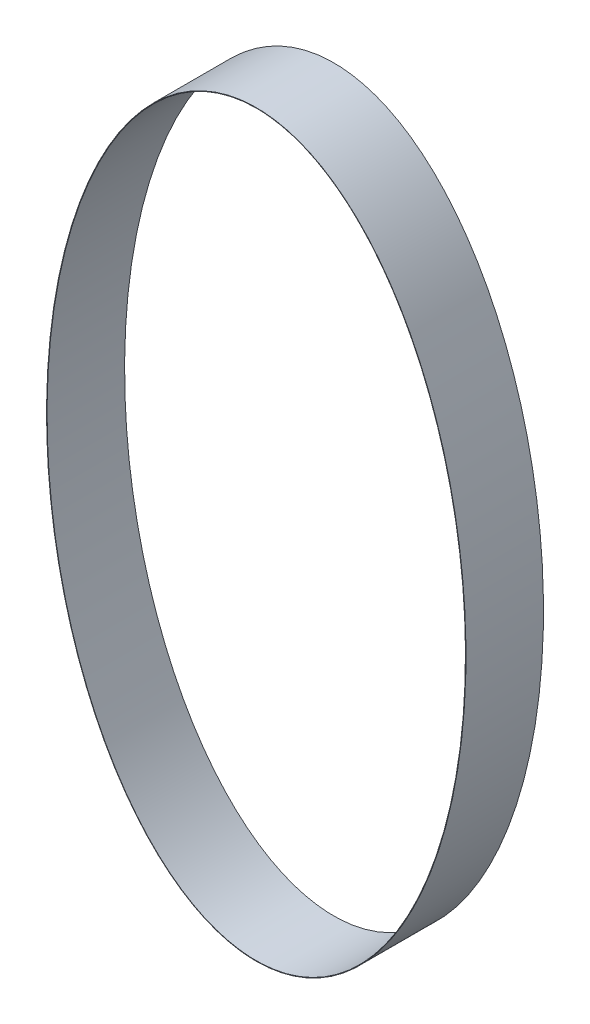
ISO-10303-21;
HEADER;
FILE_DESCRIPTION(('STEP AP214'),'2;1');
FILE_NAME('part.step','',(''),(''),'','','');
FILE_SCHEMA(('AUTOMOTIVE_DESIGN { 1 0 10303 214 1 1 1 1 }'));
ENDSEC;
DATA;
#1=APPLICATION_CONTEXT('core data for automotive mechanical design processes');
#2=APPLICATION_PROTOCOL_DEFINITION('international standard','automotive_design',2000,#1);
#3=PRODUCT_CONTEXT('',#1,'mechanical');
#4=PRODUCT('Part','Part','',(#3));
#5=PRODUCT_RELATED_PRODUCT_CATEGORY('part','',(#4));
#6=PRODUCT_DEFINITION_FORMATION('','',#4);
#7=PRODUCT_DEFINITION_CONTEXT('part definition',#1,'design');
#8=PRODUCT_DEFINITION('design','',#6,#7);
#9=PRODUCT_DEFINITION_SHAPE('','',#8);
#10=(LENGTH_UNIT() NAMED_UNIT(*) SI_UNIT(.MILLI.,.METRE.));
#11=(NAMED_UNIT(*) PLANE_ANGLE_UNIT() SI_UNIT($,.RADIAN.));
#12=(NAMED_UNIT(*) SI_UNIT($,.STERADIAN.) SOLID_ANGLE_UNIT());
#13=UNCERTAINTY_MEASURE_WITH_UNIT(LENGTH_MEASURE(1.E-05),#10,'distance_accuracy_value','');
#14=(GEOMETRIC_REPRESENTATION_CONTEXT(3) GLOBAL_UNCERTAINTY_ASSIGNED_CONTEXT((#13)) GLOBAL_UNIT_ASSIGNED_CONTEXT((#10,
#11,#12)) REPRESENTATION_CONTEXT('',''));
#15=CARTESIAN_POINT('',(0.,0.,0.));
#16=DIRECTION('',(0.,0.,1.));
#17=DIRECTION('',(1.,0.,0.));
#18=AXIS2_PLACEMENT_3D('',#15,#16,#17);
#19=CARTESIAN_POINT('',(0.95522640346659,381.504286316459,40.005));
#20=DIRECTION('',(0.,0.,-1.));
#21=DIRECTION('',(-1.,0.,0.));
#22=AXIS2_PLACEMENT_3D('',#19,#20,#21);
#23=PLANE('',#22);
#24=CARTESIAN_POINT('',(0.,-381.508,40.005));
#25=CARTESIAN_POINT('',(5.06860746852134,-381.508,40.005));
#26=CARTESIAN_POINT('',(10.080651700134,-381.194846210065,40.005));
#27=CARTESIAN_POINT('',(19.9980403594174,-379.977811334237,40.005));
#28=CARTESIAN_POINT('',(24.9033700403315,-379.07384860516,40.005));
#29=CARTESIAN_POINT('',(32.1846436224367,-377.293150657071,40.005));
#30=CARTESIAN_POINT('',(34.5989338511966,-376.628714069901,40.005));
#31=CARTESIAN_POINT('',(39.4023093953058,-375.160297711844,40.005));
#32=CARTESIAN_POINT('',(41.7927877797297,-374.355803421202,40.005));
#33=CARTESIAN_POINT('',(48.9182745677866,-371.738678905635,40.005));
#34=CARTESIAN_POINT('',(53.5360386053732,-369.749691859683,40.005));
#35=CARTESIAN_POINT('',(62.5351349099683,-365.336101736664,40.005));
#36=CARTESIAN_POINT('',(66.9163797770954,-362.911337628827,40.005));
#37=CARTESIAN_POINT('',(73.3268117040244,-358.976753281723,40.005));
#38=CARTESIAN_POINT('',(75.4366675456447,-357.615562029518,40.005));
#39=CARTESIAN_POINT('',(78.5626370804195,-355.502261497353,40.005));
#40=CARTESIAN_POINT('',(79.5981555108845,-354.785904665684,40.005));
#41=CARTESIAN_POINT('',(81.656492469039,-353.329791942105,40.005));
#42=CARTESIAN_POINT('',(82.6803079712479,-352.589292895675,40.005));
#43=CARTESIAN_POINT('',(87.7552455809092,-348.838981831497,40.005));
#44=CARTESIAN_POINT('',(91.6651392721151,-345.693654823046,40.005));
#45=CARTESIAN_POINT('',(99.2224594922293,-339.149241199157,40.005));
#46=CARTESIAN_POINT('',(102.86976577271,-335.750038324627,40.005));
#47=CARTESIAN_POINT('',(113.45992960344,-325.212344440494,40.005));
#48=CARTESIAN_POINT('',(120.053162703315,-317.735828047664,40.005));
#49=CARTESIAN_POINT('',(127.807005400265,-307.918663667377,40.005));
#50=CARTESIAN_POINT('',(129.333210684158,-305.931482441215,40.005));
#51=CARTESIAN_POINT('',(132.338256217193,-301.91132632656,40.005));
#52=CARTESIAN_POINT('',(133.818941004382,-299.875713391325,40.005));
#53=CARTESIAN_POINT('',(138.177317193406,-293.72379226869,40.005));
#54=CARTESIAN_POINT('',(140.969004262098,-289.56675330864,40.005));
#55=CARTESIAN_POINT('',(149.03615513247,-276.944899174484,40.005));
#56=CARTESIAN_POINT('',(154.00532397218,-268.330137551269,40.005));
#57=CARTESIAN_POINT('',(163.253070132247,-250.762535789129,40.005));
#58=CARTESIAN_POINT('',(167.530893184904,-241.809326399066,40.005));
#59=CARTESIAN_POINT('',(175.47735123777,-223.604680104137,40.005));
#60=CARTESIAN_POINT('',(179.145598480575,-214.35305337295,40.005));
#61=CARTESIAN_POINT('',(184.231845420286,-200.271900147928,40.005));
#62=CARTESIAN_POINT('',(185.85772710484,-195.544142111794,40.005));
#63=CARTESIAN_POINT('',(188.975447972995,-186.023005642383,40.005));
#64=CARTESIAN_POINT('',(190.461472941253,-181.247227793017,40.005));
#65=CARTESIAN_POINT('',(194.707136831891,-166.895340314192,40.005));
#66=CARTESIAN_POINT('',(197.257659953542,-157.286432193541,40.005));
#67=CARTESIAN_POINT('',(201.848792991668,-137.993959332423,40.005));
#68=CARTESIAN_POINT('',(203.889226786354,-128.310368805888,40.005));
#69=CARTESIAN_POINT('',(207.493672125557,-108.873434558664,40.005));
#70=CARTESIAN_POINT('',(209.057582152273,-99.1200759747086,40.005));
#71=CARTESIAN_POINT('',(211.730623999268,-79.546774526742,40.005));
#72=CARTESIAN_POINT('',(212.839699737427,-69.7268234517226,40.005));
#73=CARTESIAN_POINT('',(214.615137764104,-50.0221034280512,40.005));
#74=CARTESIAN_POINT('',(215.281475397204,-40.1373308695885,40.005));
#75=CARTESIAN_POINT('',(216.175088211129,-20.303502423184,40.005));
#76=CARTESIAN_POINT('',(216.402364510989,-10.3544466990802,40.005));
#77=CARTESIAN_POINT('',(216.410662727345,4.6178353781742,40.005));
#78=CARTESIAN_POINT('',(216.357735293357,9.61978662181301,40.005));
#79=CARTESIAN_POINT('',(216.14106098061,19.5936145387797,40.005));
#80=CARTESIAN_POINT('',(215.977391607286,24.570895204033,40.005));
#81=CARTESIAN_POINT('',(215.321175424922,39.4739746127025,40.005));
#82=CARTESIAN_POINT('',(214.663674170421,49.3710549235263,40.005));
#83=CARTESIAN_POINT('',(212.906717804489,69.08827174403,40.005));
#84=CARTESIAN_POINT('',(211.807281522385,78.9084115318805,40.005));
#85=CARTESIAN_POINT('',(209.156215027436,98.4699645180522,40.005));
#86=CARTESIAN_POINT('',(207.604633474188,108.211386187969,40.005));
#87=CARTESIAN_POINT('',(204.029726660789,127.612099338406,40.005));
#88=CARTESIAN_POINT('',(202.006491799108,137.271406557224,40.005));
#89=CARTESIAN_POINT('',(197.457389585685,156.502513093851,40.005));
#90=CARTESIAN_POINT('',(194.931679535016,166.074339797645,40.005));
#91=CARTESIAN_POINT('',(189.3318013842,185.122507112211,40.005));
#92=CARTESIAN_POINT('',(186.257909896902,194.598895881052,40.005));
#93=CARTESIAN_POINT('',(182.030869451122,206.377410053413,40.005));
#94=CARTESIAN_POINT('',(181.165481957024,208.731536725947,40.005));
#95=CARTESIAN_POINT('',(179.398565415938,213.422841513929,40.005));
#96=CARTESIAN_POINT('',(178.497235772423,215.759594251006,40.005));
#97=CARTESIAN_POINT('',(175.738424981424,222.742552055598,40.005));
#98=CARTESIAN_POINT('',(173.826170811565,227.361481037049,40.005));
#99=CARTESIAN_POINT('',(167.858985487828,241.103521118126,40.005));
#100=CARTESIAN_POINT('',(163.574724181348,250.112429482395,40.005));
#101=CARTESIAN_POINT('',(154.311801335294,267.784446039641,40.005));
#102=CARTESIAN_POINT('',(149.333883901231,276.447924785221,40.005));
#103=CARTESIAN_POINT('',(142.599569251185,287.022346340211,40.005));
#104=CARTESIAN_POINT('',(141.22536009406,289.126783600521,40.005));
#105=CARTESIAN_POINT('',(138.431507227753,293.295906136321,40.005));
#106=CARTESIAN_POINT('',(137.012576637843,295.359668435152,40.005));
#107=CARTESIAN_POINT('',(132.687668036583,301.486569320955,40.005));
#108=CARTESIAN_POINT('',(129.713671845214,305.485415145518,40.005));
#109=CARTESIAN_POINT('',(120.499484395732,317.205757742107,40.005));
#110=CARTESIAN_POINT('',(113.969547741985,324.653378737455,40.005));
#111=CARTESIAN_POINT('',(103.478699270663,335.166984197997,40.005));
#112=CARTESIAN_POINT('',(99.8652283955802,338.561379949128,40.005));
#113=CARTESIAN_POINT('',(92.377040014029,345.103233535711,40.005));
#114=CARTESIAN_POINT('',(88.5024425652875,348.250804853221,40.005));
#115=CARTESIAN_POINT('',(82.4665741346365,352.760456736282,40.005));
#116=CARTESIAN_POINT('',(80.4158064663773,354.22926583905,40.005));
#117=CARTESIAN_POINT('',(76.2393092805904,357.086579404227,40.005));
#118=CARTESIAN_POINT('',(74.1270091831982,358.465945990474,40.005));
#119=CARTESIAN_POINT('',(67.7154037694135,362.450948045406,40.005));
#120=CARTESIAN_POINT('',(63.3415467378939,364.903800195423,40.005));
#121=CARTESIAN_POINT('',(54.3780676424367,369.367324223019,40.005));
#122=CARTESIAN_POINT('',(49.7885071841226,371.378122352713,40.005));
#123=CARTESIAN_POINT('',(42.7255437689254,374.02825723621,40.005));
#124=CARTESIAN_POINT('',(40.34140268195,374.850523714593,40.005));
#125=CARTESIAN_POINT('',(36.7178173237749,375.98683759953,40.005));
#126=CARTESIAN_POINT('',(35.5008911746417,376.349689767248,40.005));
#127=CARTESIAN_POINT('',(33.0667845156843,377.037700847886,40.005));
#128=CARTESIAN_POINT('',(31.8478228779317,377.363455466801,40.005));
#129=CARTESIAN_POINT('',(25.7434579760028,378.900828852417,40.005));
#130=CARTESIAN_POINT('',(20.8294193367162,379.838580976288,40.005));
#131=CARTESIAN_POINT('',(10.9393108357944,381.120823129518,40.005));
#132=CARTESIAN_POINT('',(5.96324443516485,381.465346259683,40.005));
#133=CARTESIAN_POINT('',(-1.54878261238325,381.523756344847,40.005));
#134=CARTESIAN_POINT('',(-4.06078717998354,381.466757498387,40.005));
#135=CARTESIAN_POINT('',(-7.84103774992907,381.264161195904,40.005));
#136=CARTESIAN_POINT('',(-9.10316243843965,381.177107539749,40.005));
#137=CARTESIAN_POINT('',(-11.6315427282551,380.963492478216,40.005));
#138=CARTESIAN_POINT('',(-12.8938169031269,380.837222532151,40.005));
#139=CARTESIAN_POINT('',(-19.174011721568,380.112318814165,40.005));
#140=CARTESIAN_POINT('',(-24.120516267387,379.231735943224,40.005));
#141=CARTESIAN_POINT('',(-33.8687425606447,376.909982340287,40.005));
#142=CARTESIAN_POINT('',(-38.6704387434527,375.468712624005,40.005));
#143=CARTESIAN_POINT('',(-45.7700221947838,372.908151661415,40.005));
#144=CARTESIAN_POINT('',(-48.1193691493979,371.988108362231,40.005));
#145=CARTESIAN_POINT('',(-51.6181563375289,370.510342234018,40.005));
#146=CARTESIAN_POINT('',(-52.7803389011319,370.001343064054,40.005));
#147=CARTESIAN_POINT('',(-55.0832632060132,368.957270013458,40.005));
#148=CARTESIAN_POINT('',(-56.2257027421524,368.421498038351,40.005));
#149=CARTESIAN_POINT('',(-61.894272699129,365.676222126775,40.005));
#150=CARTESIAN_POINT('',(-66.2898991175842,363.268047304305,40.005));
#151=CARTESIAN_POINT('',(-74.8341052082076,358.07560960787,40.005));
#152=CARTESIAN_POINT('',(-78.9825888698252,355.291200573628,40.005));
#153=CARTESIAN_POINT('',(-87.0558125907057,349.381769658751,40.005));
#154=CARTESIAN_POINT('',(-90.9804926050011,346.256656369526,40.005));
#155=CARTESIAN_POINT('',(-95.7576026809499,342.154279364,40.005));
#156=CARTESIAN_POINT('',(-96.7065762827026,341.323987313693,40.005));
#157=CARTESIAN_POINT('',(-98.5918629977503,339.644129701054,40.005));
#158=CARTESIAN_POINT('',(-99.5279679018261,338.794713652075,40.005));
#159=CARTESIAN_POINT('',(-102.307102316207,336.228034050927,40.005));
#160=CARTESIAN_POINT('',(-104.12463591167,334.489122580848,40.005));
#161=CARTESIAN_POINT('',(-109.478299747474,329.194323992999,40.005));
#162=CARTESIAN_POINT('',(-112.915729486879,325.560559263375,40.005));
#163=CARTESIAN_POINT('',(-119.556303113019,318.108171343186,40.005));
#164=CARTESIAN_POINT('',(-122.759370107401,314.289487482282,40.005));
#165=CARTESIAN_POINT('',(-132.050430789835,302.582413801215,40.005));
#166=CARTESIAN_POINT('',(-137.821929761857,294.444300297633,40.005));
#167=CARTESIAN_POINT('',(-145.939145808168,281.811028511373,40.005));
#168=CARTESIAN_POINT('',(-148.554411539712,277.528552084471,40.005));
#169=CARTESIAN_POINT('',(-153.615082382469,268.829574181818,40.005));
#170=CARTESIAN_POINT('',(-156.045555838112,264.438694028759,40.005));
#171=CARTESIAN_POINT('',(-163.055528911275,251.166813526239,40.005));
#172=CARTESIAN_POINT('',(-167.358633469695,242.180515642892,40.005));
#173=CARTESIAN_POINT('',(-175.327799004157,223.96980547362,40.005));
#174=CARTESIAN_POINT('',(-178.99332030713,214.745191468481,40.005));
#175=CARTESIAN_POINT('',(-185.754998497077,196.083146201243,40.005));
#176=CARTESIAN_POINT('',(-188.85086674615,186.645607051956,40.005));
#177=CARTESIAN_POINT('',(-194.51887472505,167.574769299987,40.005));
#178=CARTESIAN_POINT('',(-197.090852836514,157.94141028753,40.005));
#179=CARTESIAN_POINT('',(-199.99721194363,145.784357833635,40.005));
#180=CARTESIAN_POINT('',(-200.56302019141,143.347167362173,40.005));
#181=CARTESIAN_POINT('',(-201.664057263176,138.461356430111,40.005));
#182=CARTESIAN_POINT('',(-202.199475944263,136.011748109736,40.005));
#183=CARTESIAN_POINT('',(-203.756394452269,128.66500589533,40.005));
#184=CARTESIAN_POINT('',(-204.729929825771,123.764242606959,40.005));
#185=CARTESIAN_POINT('',(-207.464784225714,109.053488127847,40.005));
#186=CARTESIAN_POINT('',(-209.040722344995,99.2350492208898,40.005));
#187=CARTESIAN_POINT('',(-211.727648321507,79.5769838535848,40.005));
#188=CARTESIAN_POINT('',(-212.838551920334,69.7373535536224,40.005));
#189=CARTESIAN_POINT('',(-214.613926808992,50.0377492542653,40.005));
#190=CARTESIAN_POINT('',(-215.278352905904,40.1777731954511,40.005));
#191=CARTESIAN_POINT('',(-216.170321262913,20.4379124975421,40.005));
#192=CARTESIAN_POINT('',(-216.397846570205,10.5580270859171,40.005));
#193=CARTESIAN_POINT('',(-216.417489816181,-9.22158503568852,40.005));
#194=CARTESIAN_POINT('',(-216.209615254981,-19.1213114038917,40.005));
#195=CARTESIAN_POINT('',(-215.351995533629,-38.9408999648625,40.005));
#196=CARTESIAN_POINT('',(-214.702283983819,-48.8607606260227,40.005));
#197=CARTESIAN_POINT('',(-213.385057850676,-63.7561664101207,40.005));
#198=CARTESIAN_POINT('',(-212.888802766121,-68.723907322436,40.005));
#199=CARTESIAN_POINT('',(-212.056550543184,-76.1795228649269,40.005));
#200=CARTESIAN_POINT('',(-211.764297007856,-78.6668662316982,40.005));
#201=CARTESIAN_POINT('',(-211.151106087495,-83.6347063783579,40.005));
#202=CARTESIAN_POINT('',(-210.830236852274,-86.1148270476561,40.005));
#203=CARTESIAN_POINT('',(-209.154200559498,-98.4963478656958,40.005));
#204=CARTESIAN_POINT('',(-207.584340161241,-108.340600781703,40.005));
#205=CARTESIAN_POINT('',(-203.972452011526,-127.903424757284,40.005));
#206=CARTESIAN_POINT('',(-201.930491708466,-137.622013770323,40.005));
#207=CARTESIAN_POINT('',(-197.349768924391,-156.926952624035,40.005));
#208=CARTESIAN_POINT('',(-194.811128365185,-166.513334917946,40.005));
#209=CARTESIAN_POINT('',(-189.199062066818,-185.543749989747,40.005));
#210=CARTESIAN_POINT('',(-186.125850283336,-194.987839718518,40.005));
#211=CARTESIAN_POINT('',(-179.388448782462,-213.718712231095,40.005));
#212=CARTESIAN_POINT('',(-175.724645810296,-223.005597959031,40.005));
#213=CARTESIAN_POINT('',(-170.723638446181,-234.502075510107,40.005));
#214=CARTESIAN_POINT('',(-169.701409454161,-236.797640395046,40.005));
#215=CARTESIAN_POINT('',(-167.618369648296,-241.365358895456,40.005));
#216=CARTESIAN_POINT('',(-166.557546985298,-243.637655298727,40.005));
#217=CARTESIAN_POINT('',(-163.315629455251,-250.418932713068,40.005));
#218=CARTESIAN_POINT('',(-161.075149449043,-254.892340507048,40.005));
#219=CARTESIAN_POINT('',(-154.101659920137,-268.161579786336,40.005));
#220=CARTESIAN_POINT('',(-149.118103020008,-276.807326984987,40.005));
#221=CARTESIAN_POINT('',(-138.375253593435,-293.634135903222,40.005));
#222=CARTESIAN_POINT('',(-132.617154143045,-301.815912305875,40.005));
#223=CARTESIAN_POINT('',(-124.830459618355,-311.690264687315,40.005));
#224=CARTESIAN_POINT('',(-123.243304950677,-313.647350364366,40.005));
#225=CARTESIAN_POINT('',(-120.023704198261,-317.503469917558,40.005));
#226=CARTESIAN_POINT('',(-118.389262998549,-319.405084540041,40.005));
#227=CARTESIAN_POINT('',(-113.409120924971,-325.027484880592,40.005));
#228=CARTESIAN_POINT('',(-109.986750650125,-328.665987061168,40.005));
#229=CARTESIAN_POINT('',(-102.918850207366,-335.703490588954,40.005));
#230=CARTESIAN_POINT('',(-99.2733782726928,-339.10255443355,40.005));
#231=CARTESIAN_POINT('',(-91.7352988667654,-345.635450023229,40.005));
#232=CARTESIAN_POINT('',(-87.8427832217092,-348.769380318509,40.005));
#233=CARTESIAN_POINT('',(-81.7949528166232,-353.245910576161,40.005));
#234=CARTESIAN_POINT('',(-79.7440986092715,-354.700620241923,40.005));
#235=CARTESIAN_POINT('',(-76.6117281549577,-356.822488455404,40.005));
#236=CARTESIAN_POINT('',(-75.5570601044259,-357.520487363683,40.005));
#237=CARTESIAN_POINT('',(-73.4370181868136,-358.890118878478,40.005));
#238=CARTESIAN_POINT('',(-72.3711318383411,-359.562137972583,40.005));
#239=CARTESIAN_POINT('',(-67.0118879876149,-362.8571916412,40.005));
#240=CARTESIAN_POINT('',(-62.6292579124398,-365.285458072089,40.005));
#241=CARTESIAN_POINT('',(-53.6586323566839,-369.693940234007,40.005));
#242=CARTESIAN_POINT('',(-49.0706888242446,-371.674269301561,40.005));
#243=CARTESIAN_POINT('',(-42.0199032282406,-374.27633446792,40.005));
#244=CARTESIAN_POINT('',(-39.6414527812437,-375.082189809158,40.005));
#245=CARTESIAN_POINT('',(-36.0291643292886,-376.193640030637,40.005));
#246=CARTESIAN_POINT('',(-34.8176290934931,-376.547893404806,40.005));
#247=CARTESIAN_POINT('',(-32.3792446476573,-377.222989283067,40.005));
#248=CARTESIAN_POINT('',(-31.1529576264674,-377.543608395302,40.005));
#249=CARTESIAN_POINT('',(-25.0178425017664,-379.052659214935,40.005));
#250=CARTESIAN_POINT('',(-20.070713061446,-379.96707913633,40.005));
#251=CARTESIAN_POINT('',(-10.0963058772931,-381.194723181664,40.005));
#252=CARTESIAN_POINT('',(-5.06860746852122,-381.508,40.005));
#253=CARTESIAN_POINT('',(0.,-381.508,40.005));
#254=B_SPLINE_CURVE_WITH_KNOTS('',3,(#24,#25,#26,#27,#28,#29,#30,#31,#32,#33,#34,#35,#36,#37,
#38,#39,#40,#41,#42,#43,#44,#45,#46,#47,#48,#49,#50,#51,#52,#53,#54,#55,#56,#57,#58,#59,#60,#61,
#62,#63,#64,#65,#66,#67,#68,#69,#70,#71,#72,#73,#74,#75,#76,#77,#78,#79,#80,#81,#82,#83,#84,#85,
#86,#87,#88,#89,#90,#91,#92,#93,#94,#95,#96,#97,#98,#99,#100,#101,#102,#103,#104,#105,#106,#107,
#108,#109,#110,#111,#112,#113,#114,#115,#116,#117,#118,#119,#120,#121,#122,#123,#124,#125,#126,
#127,#128,#129,#130,#131,#132,#133,#134,#135,#136,#137,#138,#139,#140,#141,#142,#143,#144,#145,
#146,#147,#148,#149,#150,#151,#152,#153,#154,#155,#156,#157,#158,#159,#160,#161,#162,#163,#164,
#165,#166,#167,#168,#169,#170,#171,#172,#173,#174,#175,#176,#177,#178,#179,#180,#181,#182,#183,
#184,#185,#186,#187,#188,#189,#190,#191,#192,#193,#194,#195,#196,#197,#198,#199,#200,#201,#202,
#203,#204,#205,#206,#207,#208,#209,#210,#211,#212,#213,#214,#215,#216,#217,#218,#219,#220,#221,
#222,#223,#224,#225,#226,#227,#228,#229,#230,#231,#232,#233,#234,#235,#236,#237,#238,#239,#240,
#241,#242,#243,#244,#245,#246,#247,#248,#249,#250,#251,#252,#253),.UNSPECIFIED.,.T.,.F.,(4,2,2,
2,2,2,2,2,2,2,2,2,2,2,2,2,2,2,2,2,2,2,2,2,2,2,2,2,2,2,2,2,2,2,2,2,2,2,2,2,2,2,2,2,2,2,2,2,2,2,2,
2,2,2,2,2,2,2,2,2,2,2,2,2,2,2,2,2,2,2,2,2,2,2,2,2,2,2,2,2,2,2,2,2,2,2,2,2,2,2,2,2,2,2,2,2,2,2,2,
2,2,2,2,2,2,2,2,2,2,2,2,2,2,2,4),(0.,0.00781250000000005,0.0156250000000001,0.0195312500000001,
0.0234375000000002,0.0312500000000002,0.0390625000000003,0.0429687500000003,0.0449218750000003,
0.0468750000000003,0.0546875000000002,0.0625000000000002,0.078125,0.08203125,0.0859375000000001,
0.0937500000000001,0.109375,0.125,0.140625,0.148437500000001,0.156250000000001,
0.171875000000001,0.187500000000001,0.203125000000001,0.218750000000001,0.234375000000001,
0.250000000000001,0.257812500000001,0.265625000000001,0.281250000000001,0.296875000000001,
0.312500000000001,0.328125000000001,0.343750000000001,0.359375000000002,0.363281250000002,
0.367187500000002,0.375000000000002,0.390625000000002,0.406250000000002,0.410156250000002,
0.414062500000001,0.421875000000001,0.437500000000001,0.445312500000001,0.453125000000001,
0.457031250000001,0.460937500000001,0.468750000000001,0.476562500000001,0.480468750000001,
0.482421875000001,0.484375000000001,0.4921875,0.5,0.50390625,0.505859375,0.5078125,0.515625,
0.5234375,0.52734375,0.529296875,0.53125,0.5390625,0.546875,0.5546875,0.556640625,0.55859375,
0.5625,0.5703125,0.578125,0.59375,0.6015625,0.609375,0.625,0.640625,0.65625,0.671875,0.67578125,
0.6796875,0.687500000000001,0.703125000000001,0.718750000000001,0.734375000000001,
0.750000000000001,0.765625000000001,0.781250000000001,0.789062500000001,0.792968750000001,
0.796875000000001,0.812500000000001,0.828125000000001,0.843750000000002,0.859375000000002,
0.875000000000002,0.878906250000002,0.882812500000002,0.890625000000002,0.906250000000002,
0.921875000000001,0.925781250000001,0.929687500000001,0.937500000000001,0.945312500000001,
0.953125000000001,0.957031250000001,0.958984375000001,0.960937500000001,0.96875,0.9765625,
0.98046875,0.982421875,0.984375,0.9921875,1.),.UNSPECIFIED.);
#255=CARTESIAN_POINT('',(0.,-381.508,40.005));
#256=VERTEX_POINT('',#255);
#257=EDGE_CURVE('E11',#256,#256,#254,.T.);
#258=ORIENTED_EDGE('',*,*,#257,.T.);
#259=EDGE_LOOP('',(#258));
#260=FACE_BOUND('',#259,.T.);
#261=CARTESIAN_POINT('',(0.,0.,40.005));
#262=DIRECTION('',(0.,0.,1.));
#263=DIRECTION('',(0.,1.,0.));
#264=AXIS2_PLACEMENT_3D('',#261,#262,#263);
#265=ELLIPSE('',#264,381.,215.9);
#266=CARTESIAN_POINT('',(0.,381.,40.005));
#267=VERTEX_POINT('',#266);
#268=EDGE_CURVE('E68',#267,#267,#265,.T.);
#269=ORIENTED_EDGE('',*,*,#268,.F.);
#270=EDGE_LOOP('',(#269));
#271=FACE_BOUND('',#270,.T.);
#272=ADVANCED_FACE('F53',(#260,#271),#23,.F.);
#273=CARTESIAN_POINT('',(0.95522640346659,381.504286316459,-40.005));
#274=DIRECTION('',(0.,0.,-1.));
#275=DIRECTION('',(-1.,0.,0.));
#276=AXIS2_PLACEMENT_3D('',#273,#274,#275);
#277=PLANE('',#276);
#278=CARTESIAN_POINT('',(0.,-381.508,-40.005));
#279=CARTESIAN_POINT('',(5.06860746852134,-381.508,-40.005));
#280=CARTESIAN_POINT('',(10.080651700134,-381.194846210065,-40.005));
#281=CARTESIAN_POINT('',(19.9980403594174,-379.977811334237,-40.005));
#282=CARTESIAN_POINT('',(24.9033700403315,-379.07384860516,-40.005));
#283=CARTESIAN_POINT('',(32.1846436224367,-377.293150657071,-40.005));
#284=CARTESIAN_POINT('',(34.5989338511966,-376.628714069901,-40.005));
#285=CARTESIAN_POINT('',(39.4023093953058,-375.160297711844,-40.005));
#286=CARTESIAN_POINT('',(41.7927877797297,-374.355803421202,-40.005));
#287=CARTESIAN_POINT('',(48.9182745677866,-371.738678905635,-40.005));
#288=CARTESIAN_POINT('',(53.5360386053732,-369.749691859683,-40.005));
#289=CARTESIAN_POINT('',(62.5351349099683,-365.336101736664,-40.005));
#290=CARTESIAN_POINT('',(66.9163797770954,-362.911337628827,-40.005));
#291=CARTESIAN_POINT('',(73.3268117040244,-358.976753281723,-40.005));
#292=CARTESIAN_POINT('',(75.4366675456447,-357.615562029518,-40.005));
#293=CARTESIAN_POINT('',(78.5626370804195,-355.502261497353,-40.005));
#294=CARTESIAN_POINT('',(79.5981555108845,-354.785904665684,-40.005));
#295=CARTESIAN_POINT('',(81.656492469039,-353.329791942105,-40.005));
#296=CARTESIAN_POINT('',(82.6803079712479,-352.589292895675,-40.005));
#297=CARTESIAN_POINT('',(87.7552455809092,-348.838981831497,-40.005));
#298=CARTESIAN_POINT('',(91.6651392721151,-345.693654823046,-40.005));
#299=CARTESIAN_POINT('',(99.2224594922293,-339.149241199157,-40.005));
#300=CARTESIAN_POINT('',(102.86976577271,-335.750038324627,-40.005));
#301=CARTESIAN_POINT('',(113.45992960344,-325.212344440494,-40.005));
#302=CARTESIAN_POINT('',(120.053162703315,-317.735828047664,-40.005));
#303=CARTESIAN_POINT('',(127.807005400265,-307.918663667377,-40.005));
#304=CARTESIAN_POINT('',(129.333210684158,-305.931482441215,-40.005));
#305=CARTESIAN_POINT('',(132.338256217193,-301.91132632656,-40.005));
#306=CARTESIAN_POINT('',(133.818941004382,-299.875713391325,-40.005));
#307=CARTESIAN_POINT('',(138.177317193406,-293.72379226869,-40.005));
#308=CARTESIAN_POINT('',(140.969004262098,-289.56675330864,-40.005));
#309=CARTESIAN_POINT('',(149.03615513247,-276.944899174484,-40.005));
#310=CARTESIAN_POINT('',(154.00532397218,-268.330137551269,-40.005));
#311=CARTESIAN_POINT('',(163.253070132247,-250.762535789129,-40.005));
#312=CARTESIAN_POINT('',(167.530893184904,-241.809326399066,-40.005));
#313=CARTESIAN_POINT('',(175.47735123777,-223.604680104137,-40.005));
#314=CARTESIAN_POINT('',(179.145598480575,-214.35305337295,-40.005));
#315=CARTESIAN_POINT('',(184.231845420286,-200.271900147928,-40.005));
#316=CARTESIAN_POINT('',(185.85772710484,-195.544142111794,-40.005));
#317=CARTESIAN_POINT('',(188.975447972995,-186.023005642383,-40.005));
#318=CARTESIAN_POINT('',(190.461472941253,-181.247227793017,-40.005));
#319=CARTESIAN_POINT('',(194.707136831891,-166.895340314192,-40.005));
#320=CARTESIAN_POINT('',(197.257659953542,-157.286432193541,-40.005));
#321=CARTESIAN_POINT('',(201.848792991668,-137.993959332423,-40.005));
#322=CARTESIAN_POINT('',(203.889226786354,-128.310368805888,-40.005));
#323=CARTESIAN_POINT('',(207.493672125557,-108.873434558664,-40.005));
#324=CARTESIAN_POINT('',(209.057582152273,-99.1200759747086,-40.005));
#325=CARTESIAN_POINT('',(211.730623999268,-79.546774526742,-40.005));
#326=CARTESIAN_POINT('',(212.839699737427,-69.7268234517226,-40.005));
#327=CARTESIAN_POINT('',(214.615137764104,-50.0221034280512,-40.005));
#328=CARTESIAN_POINT('',(215.281475397204,-40.1373308695885,-40.005));
#329=CARTESIAN_POINT('',(216.175088211129,-20.303502423184,-40.005));
#330=CARTESIAN_POINT('',(216.402364510989,-10.3544466990802,-40.005));
#331=CARTESIAN_POINT('',(216.410662727345,4.6178353781742,-40.005));
#332=CARTESIAN_POINT('',(216.357735293357,9.61978662181301,-40.005));
#333=CARTESIAN_POINT('',(216.14106098061,19.5936145387797,-40.005));
#334=CARTESIAN_POINT('',(215.977391607286,24.570895204033,-40.005));
#335=CARTESIAN_POINT('',(215.321175424922,39.4739746127025,-40.005));
#336=CARTESIAN_POINT('',(214.663674170421,49.3710549235263,-40.005));
#337=CARTESIAN_POINT('',(212.906717804489,69.08827174403,-40.005));
#338=CARTESIAN_POINT('',(211.807281522385,78.9084115318805,-40.005));
#339=CARTESIAN_POINT('',(209.156215027436,98.4699645180522,-40.005));
#340=CARTESIAN_POINT('',(207.604633474188,108.211386187969,-40.005));
#341=CARTESIAN_POINT('',(204.029726660789,127.612099338406,-40.005));
#342=CARTESIAN_POINT('',(202.006491799108,137.271406557224,-40.005));
#343=CARTESIAN_POINT('',(197.457389585685,156.502513093851,-40.005));
#344=CARTESIAN_POINT('',(194.931679535016,166.074339797645,-40.005));
#345=CARTESIAN_POINT('',(189.3318013842,185.122507112211,-40.005));
#346=CARTESIAN_POINT('',(186.257909896902,194.598895881052,-40.005));
#347=CARTESIAN_POINT('',(182.030869451122,206.377410053413,-40.005));
#348=CARTESIAN_POINT('',(181.165481957024,208.731536725947,-40.005));
#349=CARTESIAN_POINT('',(179.398565415938,213.422841513929,-40.005));
#350=CARTESIAN_POINT('',(178.497235772423,215.759594251006,-40.005));
#351=CARTESIAN_POINT('',(175.738424981424,222.742552055598,-40.005));
#352=CARTESIAN_POINT('',(173.826170811565,227.361481037049,-40.005));
#353=CARTESIAN_POINT('',(167.858985487828,241.103521118126,-40.005));
#354=CARTESIAN_POINT('',(163.574724181348,250.112429482395,-40.005));
#355=CARTESIAN_POINT('',(154.311801335294,267.784446039641,-40.005));
#356=CARTESIAN_POINT('',(149.333883901231,276.447924785221,-40.005));
#357=CARTESIAN_POINT('',(142.599569251185,287.022346340211,-40.005));
#358=CARTESIAN_POINT('',(141.22536009406,289.126783600521,-40.005));
#359=CARTESIAN_POINT('',(138.431507227753,293.295906136321,-40.005));
#360=CARTESIAN_POINT('',(137.012576637843,295.359668435152,-40.005));
#361=CARTESIAN_POINT('',(132.687668036583,301.486569320955,-40.005));
#362=CARTESIAN_POINT('',(129.713671845214,305.485415145518,-40.005));
#363=CARTESIAN_POINT('',(120.499484395732,317.205757742107,-40.005));
#364=CARTESIAN_POINT('',(113.969547741985,324.653378737455,-40.005));
#365=CARTESIAN_POINT('',(103.478699270663,335.166984197997,-40.005));
#366=CARTESIAN_POINT('',(99.8652283955802,338.561379949128,-40.005));
#367=CARTESIAN_POINT('',(92.377040014029,345.103233535711,-40.005));
#368=CARTESIAN_POINT('',(88.5024425652875,348.250804853221,-40.005));
#369=CARTESIAN_POINT('',(82.4665741346365,352.760456736282,-40.005));
#370=CARTESIAN_POINT('',(80.4158064663773,354.22926583905,-40.005));
#371=CARTESIAN_POINT('',(76.2393092805904,357.086579404227,-40.005));
#372=CARTESIAN_POINT('',(74.1270091831982,358.465945990474,-40.005));
#373=CARTESIAN_POINT('',(67.7154037694135,362.450948045406,-40.005));
#374=CARTESIAN_POINT('',(63.3415467378939,364.903800195423,-40.005));
#375=CARTESIAN_POINT('',(54.3780676424367,369.367324223019,-40.005));
#376=CARTESIAN_POINT('',(49.7885071841226,371.378122352713,-40.005));
#377=CARTESIAN_POINT('',(42.7255437689254,374.02825723621,-40.005));
#378=CARTESIAN_POINT('',(40.34140268195,374.850523714593,-40.005));
#379=CARTESIAN_POINT('',(36.7178173237749,375.98683759953,-40.005));
#380=CARTESIAN_POINT('',(35.5008911746417,376.349689767248,-40.005));
#381=CARTESIAN_POINT('',(33.0667845156843,377.037700847886,-40.005));
#382=CARTESIAN_POINT('',(31.8478228779317,377.363455466801,-40.005));
#383=CARTESIAN_POINT('',(25.7434579760028,378.900828852417,-40.005));
#384=CARTESIAN_POINT('',(20.8294193367162,379.838580976288,-40.005));
#385=CARTESIAN_POINT('',(10.9393108357944,381.120823129518,-40.005));
#386=CARTESIAN_POINT('',(5.96324443516485,381.465346259683,-40.005));
#387=CARTESIAN_POINT('',(-1.54878261238325,381.523756344847,-40.005));
#388=CARTESIAN_POINT('',(-4.06078717998354,381.466757498387,-40.005));
#389=CARTESIAN_POINT('',(-7.84103774992907,381.264161195904,-40.005));
#390=CARTESIAN_POINT('',(-9.10316243843965,381.177107539749,-40.005));
#391=CARTESIAN_POINT('',(-11.6315427282551,380.963492478216,-40.005));
#392=CARTESIAN_POINT('',(-12.8938169031269,380.837222532151,-40.005));
#393=CARTESIAN_POINT('',(-19.174011721568,380.112318814165,-40.005));
#394=CARTESIAN_POINT('',(-24.120516267387,379.231735943224,-40.005));
#395=CARTESIAN_POINT('',(-33.8687425606447,376.909982340287,-40.005));
#396=CARTESIAN_POINT('',(-38.6704387434527,375.468712624005,-40.005));
#397=CARTESIAN_POINT('',(-45.7700221947838,372.908151661415,-40.005));
#398=CARTESIAN_POINT('',(-48.1193691493979,371.988108362231,-40.005));
#399=CARTESIAN_POINT('',(-51.6181563375289,370.510342234018,-40.005));
#400=CARTESIAN_POINT('',(-52.7803389011319,370.001343064054,-40.005));
#401=CARTESIAN_POINT('',(-55.0832632060132,368.957270013458,-40.005));
#402=CARTESIAN_POINT('',(-56.2257027421524,368.421498038351,-40.005));
#403=CARTESIAN_POINT('',(-61.894272699129,365.676222126775,-40.005));
#404=CARTESIAN_POINT('',(-66.2898991175842,363.268047304305,-40.005));
#405=CARTESIAN_POINT('',(-74.8341052082076,358.07560960787,-40.005));
#406=CARTESIAN_POINT('',(-78.9825888698252,355.291200573628,-40.005));
#407=CARTESIAN_POINT('',(-87.0558125907057,349.381769658751,-40.005));
#408=CARTESIAN_POINT('',(-90.9804926050011,346.256656369526,-40.005));
#409=CARTESIAN_POINT('',(-95.7576026809499,342.154279364,-40.005));
#410=CARTESIAN_POINT('',(-96.7065762827026,341.323987313693,-40.005));
#411=CARTESIAN_POINT('',(-98.5918629977503,339.644129701054,-40.005));
#412=CARTESIAN_POINT('',(-99.5279679018261,338.794713652075,-40.005));
#413=CARTESIAN_POINT('',(-102.307102316207,336.228034050927,-40.005));
#414=CARTESIAN_POINT('',(-104.12463591167,334.489122580848,-40.005));
#415=CARTESIAN_POINT('',(-109.478299747474,329.194323992999,-40.005));
#416=CARTESIAN_POINT('',(-112.915729486879,325.560559263375,-40.005));
#417=CARTESIAN_POINT('',(-119.556303113019,318.108171343186,-40.005));
#418=CARTESIAN_POINT('',(-122.759370107401,314.289487482282,-40.005));
#419=CARTESIAN_POINT('',(-132.050430789835,302.582413801215,-40.005));
#420=CARTESIAN_POINT('',(-137.821929761857,294.444300297633,-40.005));
#421=CARTESIAN_POINT('',(-145.939145808168,281.811028511373,-40.005));
#422=CARTESIAN_POINT('',(-148.554411539712,277.528552084471,-40.005));
#423=CARTESIAN_POINT('',(-153.615082382469,268.829574181818,-40.005));
#424=CARTESIAN_POINT('',(-156.045555838112,264.438694028759,-40.005));
#425=CARTESIAN_POINT('',(-163.055528911275,251.166813526239,-40.005));
#426=CARTESIAN_POINT('',(-167.358633469695,242.180515642892,-40.005));
#427=CARTESIAN_POINT('',(-175.327799004157,223.96980547362,-40.005));
#428=CARTESIAN_POINT('',(-178.99332030713,214.745191468481,-40.005));
#429=CARTESIAN_POINT('',(-185.754998497077,196.083146201243,-40.005));
#430=CARTESIAN_POINT('',(-188.85086674615,186.645607051956,-40.005));
#431=CARTESIAN_POINT('',(-194.51887472505,167.574769299987,-40.005));
#432=CARTESIAN_POINT('',(-197.090852836514,157.94141028753,-40.005));
#433=CARTESIAN_POINT('',(-199.99721194363,145.784357833635,-40.005));
#434=CARTESIAN_POINT('',(-200.56302019141,143.347167362173,-40.005));
#435=CARTESIAN_POINT('',(-201.664057263176,138.461356430111,-40.005));
#436=CARTESIAN_POINT('',(-202.199475944263,136.011748109736,-40.005));
#437=CARTESIAN_POINT('',(-203.756394452269,128.66500589533,-40.005));
#438=CARTESIAN_POINT('',(-204.729929825771,123.764242606959,-40.005));
#439=CARTESIAN_POINT('',(-207.464784225714,109.053488127847,-40.005));
#440=CARTESIAN_POINT('',(-209.040722344995,99.2350492208898,-40.005));
#441=CARTESIAN_POINT('',(-211.727648321507,79.5769838535848,-40.005));
#442=CARTESIAN_POINT('',(-212.838551920334,69.7373535536224,-40.005));
#443=CARTESIAN_POINT('',(-214.613926808992,50.0377492542653,-40.005));
#444=CARTESIAN_POINT('',(-215.278352905904,40.1777731954511,-40.005));
#445=CARTESIAN_POINT('',(-216.170321262913,20.4379124975421,-40.005));
#446=CARTESIAN_POINT('',(-216.397846570205,10.5580270859171,-40.005));
#447=CARTESIAN_POINT('',(-216.417489816181,-9.22158503568852,-40.005));
#448=CARTESIAN_POINT('',(-216.209615254981,-19.1213114038917,-40.005));
#449=CARTESIAN_POINT('',(-215.351995533629,-38.9408999648625,-40.005));
#450=CARTESIAN_POINT('',(-214.702283983819,-48.8607606260227,-40.005));
#451=CARTESIAN_POINT('',(-213.385057850676,-63.7561664101207,-40.005));
#452=CARTESIAN_POINT('',(-212.888802766121,-68.723907322436,-40.005));
#453=CARTESIAN_POINT('',(-212.056550543184,-76.1795228649269,-40.005));
#454=CARTESIAN_POINT('',(-211.764297007856,-78.6668662316982,-40.005));
#455=CARTESIAN_POINT('',(-211.151106087495,-83.6347063783579,-40.005));
#456=CARTESIAN_POINT('',(-210.830236852274,-86.1148270476561,-40.005));
#457=CARTESIAN_POINT('',(-209.154200559498,-98.4963478656958,-40.005));
#458=CARTESIAN_POINT('',(-207.584340161241,-108.340600781703,-40.005));
#459=CARTESIAN_POINT('',(-203.972452011526,-127.903424757284,-40.005));
#460=CARTESIAN_POINT('',(-201.930491708466,-137.622013770323,-40.005));
#461=CARTESIAN_POINT('',(-197.349768924391,-156.926952624035,-40.005));
#462=CARTESIAN_POINT('',(-194.811128365185,-166.513334917946,-40.005));
#463=CARTESIAN_POINT('',(-189.199062066818,-185.543749989747,-40.005));
#464=CARTESIAN_POINT('',(-186.125850283336,-194.987839718518,-40.005));
#465=CARTESIAN_POINT('',(-179.388448782462,-213.718712231095,-40.005));
#466=CARTESIAN_POINT('',(-175.724645810296,-223.005597959031,-40.005));
#467=CARTESIAN_POINT('',(-170.723638446181,-234.502075510107,-40.005));
#468=CARTESIAN_POINT('',(-169.701409454161,-236.797640395046,-40.005));
#469=CARTESIAN_POINT('',(-167.618369648296,-241.365358895456,-40.005));
#470=CARTESIAN_POINT('',(-166.557546985298,-243.637655298727,-40.005));
#471=CARTESIAN_POINT('',(-163.315629455251,-250.418932713068,-40.005));
#472=CARTESIAN_POINT('',(-161.075149449043,-254.892340507048,-40.005));
#473=CARTESIAN_POINT('',(-154.101659920137,-268.161579786336,-40.005));
#474=CARTESIAN_POINT('',(-149.118103020008,-276.807326984987,-40.005));
#475=CARTESIAN_POINT('',(-138.375253593435,-293.634135903222,-40.005));
#476=CARTESIAN_POINT('',(-132.617154143045,-301.815912305875,-40.005));
#477=CARTESIAN_POINT('',(-124.830459618355,-311.690264687315,-40.005));
#478=CARTESIAN_POINT('',(-123.243304950677,-313.647350364366,-40.005));
#479=CARTESIAN_POINT('',(-120.023704198261,-317.503469917558,-40.005));
#480=CARTESIAN_POINT('',(-118.389262998549,-319.405084540041,-40.005));
#481=CARTESIAN_POINT('',(-113.409120924971,-325.027484880592,-40.005));
#482=CARTESIAN_POINT('',(-109.986750650125,-328.665987061168,-40.005));
#483=CARTESIAN_POINT('',(-102.918850207366,-335.703490588954,-40.005));
#484=CARTESIAN_POINT('',(-99.2733782726928,-339.10255443355,-40.005));
#485=CARTESIAN_POINT('',(-91.7352988667654,-345.635450023229,-40.005));
#486=CARTESIAN_POINT('',(-87.8427832217092,-348.769380318509,-40.005));
#487=CARTESIAN_POINT('',(-81.7949528166232,-353.245910576161,-40.005));
#488=CARTESIAN_POINT('',(-79.7440986092715,-354.700620241923,-40.005));
#489=CARTESIAN_POINT('',(-76.6117281549577,-356.822488455404,-40.005));
#490=CARTESIAN_POINT('',(-75.5570601044259,-357.520487363683,-40.005));
#491=CARTESIAN_POINT('',(-73.4370181868136,-358.890118878478,-40.005));
#492=CARTESIAN_POINT('',(-72.3711318383411,-359.562137972583,-40.005));
#493=CARTESIAN_POINT('',(-67.0118879876149,-362.8571916412,-40.005));
#494=CARTESIAN_POINT('',(-62.6292579124398,-365.285458072089,-40.005));
#495=CARTESIAN_POINT('',(-53.6586323566839,-369.693940234007,-40.005));
#496=CARTESIAN_POINT('',(-49.0706888242446,-371.674269301561,-40.005));
#497=CARTESIAN_POINT('',(-42.0199032282406,-374.27633446792,-40.005));
#498=CARTESIAN_POINT('',(-39.6414527812437,-375.082189809158,-40.005));
#499=CARTESIAN_POINT('',(-36.0291643292886,-376.193640030637,-40.005));
#500=CARTESIAN_POINT('',(-34.8176290934931,-376.547893404806,-40.005));
#501=CARTESIAN_POINT('',(-32.3792446476573,-377.222989283067,-40.005));
#502=CARTESIAN_POINT('',(-31.1529576264674,-377.543608395302,-40.005));
#503=CARTESIAN_POINT('',(-25.0178425017664,-379.052659214935,-40.005));
#504=CARTESIAN_POINT('',(-20.070713061446,-379.96707913633,-40.005));
#505=CARTESIAN_POINT('',(-10.0963058772931,-381.194723181664,-40.005));
#506=CARTESIAN_POINT('',(-5.06860746852122,-381.508,-40.005));
#507=CARTESIAN_POINT('',(0.,-381.508,-40.005));
#508=B_SPLINE_CURVE_WITH_KNOTS('',3,(#278,#279,#280,#281,#282,#283,#284,#285,#286,#287,#288,
#289,#290,#291,#292,#293,#294,#295,#296,#297,#298,#299,#300,#301,#302,#303,#304,#305,#306,#307,
#308,#309,#310,#311,#312,#313,#314,#315,#316,#317,#318,#319,#320,#321,#322,#323,#324,#325,#326,
#327,#328,#329,#330,#331,#332,#333,#334,#335,#336,#337,#338,#339,#340,#341,#342,#343,#344,#345,
#346,#347,#348,#349,#350,#351,#352,#353,#354,#355,#356,#357,#358,#359,#360,#361,#362,#363,#364,
#365,#366,#367,#368,#369,#370,#371,#372,#373,#374,#375,#376,#377,#378,#379,#380,#381,#382,#383,
#384,#385,#386,#387,#388,#389,#390,#391,#392,#393,#394,#395,#396,#397,#398,#399,#400,#401,#402,
#403,#404,#405,#406,#407,#408,#409,#410,#411,#412,#413,#414,#415,#416,#417,#418,#419,#420,#421,
#422,#423,#424,#425,#426,#427,#428,#429,#430,#431,#432,#433,#434,#435,#436,#437,#438,#439,#440,
#441,#442,#443,#444,#445,#446,#447,#448,#449,#450,#451,#452,#453,#454,#455,#456,#457,#458,#459,
#460,#461,#462,#463,#464,#465,#466,#467,#468,#469,#470,#471,#472,#473,#474,#475,#476,#477,#478,
#479,#480,#481,#482,#483,#484,#485,#486,#487,#488,#489,#490,#491,#492,#493,#494,#495,#496,#497,
#498,#499,#500,#501,#502,#503,#504,#505,#506,#507),.UNSPECIFIED.,.T.,.F.,(4,2,2,2,2,2,2,2,2,2,2,
2,2,2,2,2,2,2,2,2,2,2,2,2,2,2,2,2,2,2,2,2,2,2,2,2,2,2,2,2,2,2,2,2,2,2,2,2,2,2,2,2,2,2,2,2,2,2,2,
2,2,2,2,2,2,2,2,2,2,2,2,2,2,2,2,2,2,2,2,2,2,2,2,2,2,2,2,2,2,2,2,2,2,2,2,2,2,2,2,2,2,2,2,2,2,2,2,
2,2,2,2,2,2,2,4),(0.,0.00781250000000005,0.0156250000000001,0.0195312500000001,
0.0234375000000002,0.0312500000000002,0.0390625000000003,0.0429687500000003,0.0449218750000003,
0.0468750000000003,0.0546875000000002,0.0625000000000002,0.078125,0.08203125,0.0859375000000001,
0.0937500000000001,0.109375,0.125,0.140625,0.148437500000001,0.156250000000001,
0.171875000000001,0.187500000000001,0.203125000000001,0.218750000000001,0.234375000000001,
0.250000000000001,0.257812500000001,0.265625000000001,0.281250000000001,0.296875000000001,
0.312500000000001,0.328125000000001,0.343750000000001,0.359375000000002,0.363281250000002,
0.367187500000002,0.375000000000002,0.390625000000002,0.406250000000002,0.410156250000002,
0.414062500000001,0.421875000000001,0.437500000000001,0.445312500000001,0.453125000000001,
0.457031250000001,0.460937500000001,0.468750000000001,0.476562500000001,0.480468750000001,
0.482421875000001,0.484375000000001,0.4921875,0.5,0.50390625,0.505859375,0.5078125,0.515625,
0.5234375,0.52734375,0.529296875,0.53125,0.5390625,0.546875,0.5546875,0.556640625,0.55859375,
0.5625,0.5703125,0.578125,0.59375,0.6015625,0.609375,0.625,0.640625,0.65625,0.671875,0.67578125,
0.6796875,0.687500000000001,0.703125000000001,0.718750000000001,0.734375000000001,
0.750000000000001,0.765625000000001,0.781250000000001,0.789062500000001,0.792968750000001,
0.796875000000001,0.812500000000001,0.828125000000001,0.843750000000002,0.859375000000002,
0.875000000000002,0.878906250000002,0.882812500000002,0.890625000000002,0.906250000000002,
0.921875000000001,0.925781250000001,0.929687500000001,0.937500000000001,0.945312500000001,
0.953125000000001,0.957031250000001,0.958984375000001,0.960937500000001,0.96875,0.9765625,
0.98046875,0.982421875,0.984375,0.9921875,1.),.UNSPECIFIED.);
#509=CARTESIAN_POINT('',(0.,-381.508,-40.005));
#510=VERTEX_POINT('',#509);
#511=EDGE_CURVE('E56',#510,#510,#508,.T.);
#512=ORIENTED_EDGE('',*,*,#511,.F.);
#513=EDGE_LOOP('',(#512));
#514=FACE_BOUND('',#513,.T.);
#515=CARTESIAN_POINT('',(0.,0.,-40.005));
#516=DIRECTION('',(0.,0.,1.));
#517=DIRECTION('',(0.,1.,0.));
#518=AXIS2_PLACEMENT_3D('',#515,#516,#517);
#519=ELLIPSE('',#518,381.,215.9);
#520=CARTESIAN_POINT('',(0.,381.,-40.005));
#521=VERTEX_POINT('',#520);
#522=EDGE_CURVE('E74',#521,#521,#519,.T.);
#523=ORIENTED_EDGE('',*,*,#522,.T.);
#524=EDGE_LOOP('',(#523));
#525=FACE_BOUND('',#524,.T.);
#526=ADVANCED_FACE('F89',(#514,#525),#277,.T.);
#527=DIRECTION('',(0.,0.,-1.));
#528=VECTOR('',#527,1.);
#529=SURFACE_OF_LINEAR_EXTRUSION('',#254,#528);
#530=ORIENTED_EDGE('',*,*,#257,.F.);
#531=EDGE_LOOP('',(#530));
#532=FACE_BOUND('',#531,.T.);
#533=ORIENTED_EDGE('',*,*,#511,.T.);
#534=EDGE_LOOP('',(#533));
#535=FACE_BOUND('',#534,.T.);
#536=ADVANCED_FACE('F57',(#532,#535),#529,.F.);
#537=DIRECTION('',(0.,0.,-1.));
#538=VECTOR('',#537,1.);
#539=SURFACE_OF_LINEAR_EXTRUSION('',#265,#538);
#540=ORIENTED_EDGE('',*,*,#268,.T.);
#541=EDGE_LOOP('',(#540));
#542=FACE_BOUND('',#541,.T.);
#543=ORIENTED_EDGE('',*,*,#522,.F.);
#544=EDGE_LOOP('',(#543));
#545=FACE_BOUND('',#544,.T.);
#546=ADVANCED_FACE('F85',(#542,#545),#539,.T.);
#547=CLOSED_SHELL('',(#272,#526,#536,#546));
#548=MANIFOLD_SOLID_BREP('B2',#547);
#549=ADVANCED_BREP_SHAPE_REPRESENTATION('',(#18,#548),#14);
#550=SHAPE_DEFINITION_REPRESENTATION(#9,#549);
ENDSEC;
END-ISO-10303-21;
